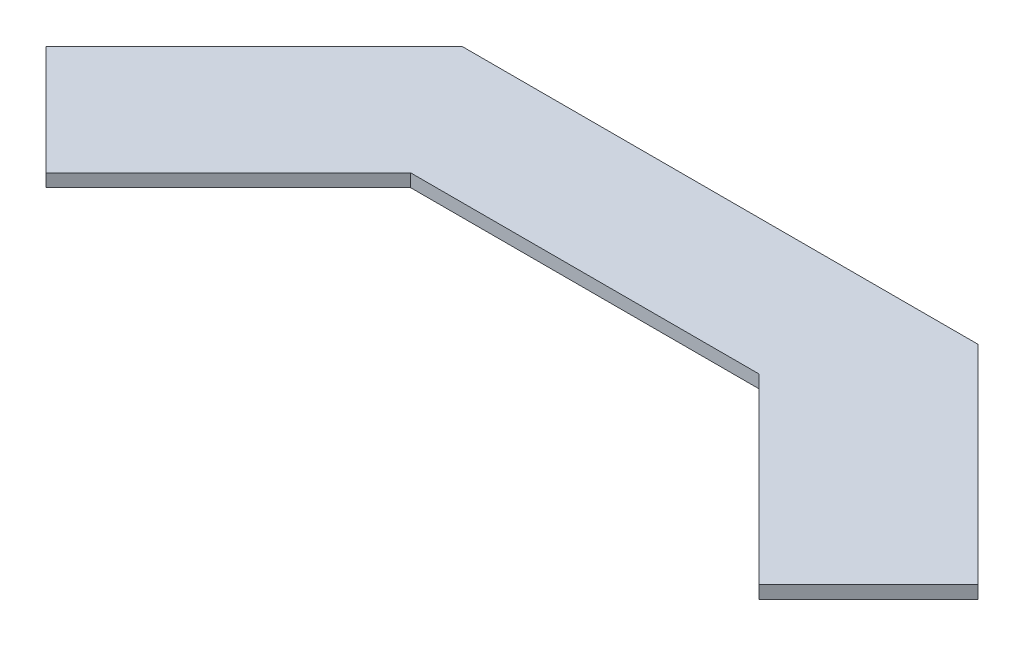
ISO-10303-21;
HEADER;
FILE_DESCRIPTION(('STEP AP214'),'2;1');
FILE_NAME('part.step','',(''),(''),'','','');
FILE_SCHEMA(('AUTOMOTIVE_DESIGN { 1 0 10303 214 1 1 1 1 }'));
ENDSEC;
DATA;
#1=APPLICATION_CONTEXT('core data for automotive mechanical design processes');
#2=APPLICATION_PROTOCOL_DEFINITION('international standard','automotive_design',2000,#1);
#3=PRODUCT_CONTEXT('',#1,'mechanical');
#4=PRODUCT('Part','Part','',(#3));
#5=PRODUCT_RELATED_PRODUCT_CATEGORY('part','',(#4));
#6=PRODUCT_DEFINITION_FORMATION('','',#4);
#7=PRODUCT_DEFINITION_CONTEXT('part definition',#1,'design');
#8=PRODUCT_DEFINITION('design','',#6,#7);
#9=PRODUCT_DEFINITION_SHAPE('','',#8);
#10=(LENGTH_UNIT() NAMED_UNIT(*) SI_UNIT(.MILLI.,.METRE.));
#11=(NAMED_UNIT(*) PLANE_ANGLE_UNIT() SI_UNIT($,.RADIAN.));
#12=(NAMED_UNIT(*) SI_UNIT($,.STERADIAN.) SOLID_ANGLE_UNIT());
#13=UNCERTAINTY_MEASURE_WITH_UNIT(LENGTH_MEASURE(1.E-05),#10,'distance_accuracy_value','');
#14=(GEOMETRIC_REPRESENTATION_CONTEXT(3) GLOBAL_UNCERTAINTY_ASSIGNED_CONTEXT((#13)) GLOBAL_UNIT_ASSIGNED_CONTEXT((#10,
#11,#12)) REPRESENTATION_CONTEXT('',''));
#15=CARTESIAN_POINT('',(0.,0.,0.));
#16=DIRECTION('',(0.,0.,1.));
#17=DIRECTION('',(1.,0.,0.));
#18=AXIS2_PLACEMENT_3D('',#15,#16,#17);
#19=CARTESIAN_POINT('',(-85.8184632735846,6.35,0.));
#20=DIRECTION('',(0.,0.,-1.));
#21=DIRECTION('',(-1.,0.,0.));
#22=AXIS2_PLACEMENT_3D('',#19,#20,#21);
#23=PLANE('',#22);
#24=DIRECTION('',(1.,0.,0.));
#25=VECTOR('',#24,1.);
#26=CARTESIAN_POINT('',(-85.8184632735846,0.,0.));
#27=LINE('',#26,#25);
#28=CARTESIAN_POINT('',(-85.8184632735846,0.,0.));
#29=VERTEX_POINT('',#28);
#30=CARTESIAN_POINT('',(85.818463273585,0.,1.05351117430378E-13));
#31=VERTEX_POINT('',#30);
#32=EDGE_CURVE('E155',#29,#31,#27,.T.);
#33=ORIENTED_EDGE('',*,*,#32,.T.);
#34=DIRECTION('',(0.,-1.,0.));
#35=VECTOR('',#34,1.);
#36=CARTESIAN_POINT('',(85.818463273585,6.35,1.05351117430378E-13));
#37=LINE('',#36,#35);
#38=CARTESIAN_POINT('',(85.818463273585,6.35,1.05351117430378E-13));
#39=VERTEX_POINT('',#38);
#40=EDGE_CURVE('E11',#39,#31,#37,.T.);
#41=ORIENTED_EDGE('',*,*,#40,.F.);
#42=DIRECTION('',(1.,0.,0.));
#43=VECTOR('',#42,1.);
#44=CARTESIAN_POINT('',(-85.8184632735846,6.35,0.));
#45=LINE('',#44,#43);
#46=CARTESIAN_POINT('',(-85.8184632735846,6.35,0.));
#47=VERTEX_POINT('',#46);
#48=EDGE_CURVE('E178',#47,#39,#45,.T.);
#49=ORIENTED_EDGE('',*,*,#48,.F.);
#50=DIRECTION('',(0.,-1.,0.));
#51=VECTOR('',#50,1.);
#52=CARTESIAN_POINT('',(-85.8184632735846,6.35,0.));
#53=LINE('',#52,#51);
#54=EDGE_CURVE('E151',#47,#29,#53,.T.);
#55=ORIENTED_EDGE('',*,*,#54,.T.);
#56=EDGE_LOOP('',(#33,#41,#49,#55));
#57=FACE_BOUND('',#56,.T.);
#58=ADVANCED_FACE('F38',(#57),#23,.F.);
#59=CARTESIAN_POINT('',(175.621024484277,6.35,89.8025612106914));
#60=DIRECTION('',(0.707106781186544,0.,-0.707106781186551));
#61=DIRECTION('',(-0.707106781186551,0.,-0.707106781186544));
#62=AXIS2_PLACEMENT_3D('',#59,#60,#61);
#63=PLANE('',#62);
#64=DIRECTION('',(0.707106781186551,0.,0.707106781186544));
#65=VECTOR('',#64,1.);
#66=CARTESIAN_POINT('',(175.621024484277,0.,89.8025612106914));
#67=LINE('',#66,#65);
#68=CARTESIAN_POINT('',(175.621024484277,0.,89.8025612106914));
#69=VERTEX_POINT('',#68);
#70=EDGE_CURVE('E159',#31,#69,#67,.T.);
#71=ORIENTED_EDGE('',*,*,#70,.T.);
#72=DIRECTION('',(0.,-1.,0.));
#73=VECTOR('',#72,1.);
#74=CARTESIAN_POINT('',(175.621024484277,6.35,89.8025612106914));
#75=LINE('',#74,#73);
#76=CARTESIAN_POINT('',(175.621024484277,6.35,89.8025612106914));
#77=VERTEX_POINT('',#76);
#78=EDGE_CURVE('E47',#77,#69,#75,.T.);
#79=ORIENTED_EDGE('',*,*,#78,.F.);
#80=DIRECTION('',(0.707106781186551,0.,0.707106781186544));
#81=VECTOR('',#80,1.);
#82=CARTESIAN_POINT('',(175.621024484277,6.35,89.8025612106914));
#83=LINE('',#82,#81);
#84=EDGE_CURVE('E109',#39,#77,#83,.T.);
#85=ORIENTED_EDGE('',*,*,#84,.F.);
#86=ORIENTED_EDGE('',*,*,#40,.T.);
#87=EDGE_LOOP('',(#71,#79,#85,#86));
#88=FACE_BOUND('',#87,.T.);
#89=ADVANCED_FACE('F223',(#88),#63,.F.);
#90=CARTESIAN_POINT('',(229.502561210692,6.35,35.9210244842762));
#91=DIRECTION('',(-0.707106781186551,0.,-0.707106781186543));
#92=DIRECTION('',(-0.707106781186544,0.,0.707106781186552));
#93=AXIS2_PLACEMENT_3D('',#90,#91,#92);
#94=PLANE('',#93);
#95=DIRECTION('',(0.707106781186543,0.,-0.707106781186552));
#96=VECTOR('',#95,1.);
#97=CARTESIAN_POINT('',(229.502561210692,0.,35.9210244842762));
#98=LINE('',#97,#96);
#99=CARTESIAN_POINT('',(229.502561210692,0.,35.9210244842762));
#100=VERTEX_POINT('',#99);
#101=EDGE_CURVE('E162',#69,#100,#98,.T.);
#102=ORIENTED_EDGE('',*,*,#101,.T.);
#103=DIRECTION('',(0.,-1.,0.));
#104=VECTOR('',#103,1.);
#105=CARTESIAN_POINT('',(229.502561210692,6.35,35.9210244842762));
#106=LINE('',#105,#104);
#107=CARTESIAN_POINT('',(229.502561210692,6.35,35.9210244842762));
#108=VERTEX_POINT('',#107);
#109=EDGE_CURVE('E189',#108,#100,#106,.T.);
#110=ORIENTED_EDGE('',*,*,#109,.F.);
#111=DIRECTION('',(0.707106781186543,0.,-0.707106781186552));
#112=VECTOR('',#111,1.);
#113=CARTESIAN_POINT('',(229.502561210692,6.35,35.9210244842762));
#114=LINE('',#113,#112);
#115=EDGE_CURVE('E199',#77,#108,#114,.T.);
#116=ORIENTED_EDGE('',*,*,#115,.F.);
#117=ORIENTED_EDGE('',*,*,#78,.T.);
#118=EDGE_LOOP('',(#102,#110,#116,#117));
#119=FACE_BOUND('',#118,.T.);
#120=ADVANCED_FACE('F197',(#119),#94,.F.);
#121=CARTESIAN_POINT('',(127.,6.35,-66.5815367264155));
#122=DIRECTION('',(-0.707106781186552,0.,0.707106781186543));
#123=DIRECTION('',(0.707106781186543,0.,0.707106781186552));
#124=AXIS2_PLACEMENT_3D('',#121,#122,#123);
#125=PLANE('',#124);
#126=DIRECTION('',(-0.707106781186543,0.,-0.707106781186552));
#127=VECTOR('',#126,1.);
#128=CARTESIAN_POINT('',(127.,0.,-66.5815367264155));
#129=LINE('',#128,#127);
#130=CARTESIAN_POINT('',(127.,0.,-66.5815367264155));
#131=VERTEX_POINT('',#130);
#132=EDGE_CURVE('E166',#100,#131,#129,.T.);
#133=ORIENTED_EDGE('',*,*,#132,.T.);
#134=DIRECTION('',(0.,-1.,0.));
#135=VECTOR('',#134,1.);
#136=CARTESIAN_POINT('',(127.,6.35,-66.5815367264155));
#137=LINE('',#136,#135);
#138=CARTESIAN_POINT('',(127.,6.35,-66.5815367264155));
#139=VERTEX_POINT('',#138);
#140=EDGE_CURVE('E185',#139,#131,#137,.T.);
#141=ORIENTED_EDGE('',*,*,#140,.F.);
#142=DIRECTION('',(-0.707106781186551,0.,-0.707106781186544));
#143=VECTOR('',#142,1.);
#144=CARTESIAN_POINT('',(229.502561210692,6.35,35.9210244842762));
#145=LINE('',#144,#143);
#146=EDGE_CURVE('E211',#108,#139,#145,.T.);
#147=ORIENTED_EDGE('',*,*,#146,.F.);
#148=ORIENTED_EDGE('',*,*,#109,.T.);
#149=EDGE_LOOP('',(#133,#141,#147,#148));
#150=FACE_BOUND('',#149,.T.);
#151=ADVANCED_FACE('F206',(#150),#125,.F.);
#152=CARTESIAN_POINT('',(127.,6.35,-66.5815367264155));
#153=DIRECTION('',(0.,0.,1.));
#154=DIRECTION('',(1.,0.,0.));
#155=AXIS2_PLACEMENT_3D('',#152,#153,#154);
#156=PLANE('',#155);
#157=DIRECTION('',(-1.,0.,0.));
#158=VECTOR('',#157,1.);
#159=CARTESIAN_POINT('',(127.,0.,-66.5815367264155));
#160=LINE('',#159,#158);
#161=CARTESIAN_POINT('',(-127.,0.,-66.5815367264155));
#162=VERTEX_POINT('',#161);
#163=EDGE_CURVE('E168',#131,#162,#160,.T.);
#164=ORIENTED_EDGE('',*,*,#163,.T.);
#165=DIRECTION('',(0.,-1.,0.));
#166=VECTOR('',#165,1.);
#167=CARTESIAN_POINT('',(-127.,6.35,-66.5815367264155));
#168=LINE('',#167,#166);
#169=CARTESIAN_POINT('',(-127.,6.35,-66.5815367264155));
#170=VERTEX_POINT('',#169);
#171=EDGE_CURVE('E143',#170,#162,#168,.T.);
#172=ORIENTED_EDGE('',*,*,#171,.F.);
#173=DIRECTION('',(-1.,0.,0.));
#174=VECTOR('',#173,1.);
#175=CARTESIAN_POINT('',(127.,6.35,-66.5815367264155));
#176=LINE('',#175,#174);
#177=EDGE_CURVE('E133',#139,#170,#176,.T.);
#178=ORIENTED_EDGE('',*,*,#177,.F.);
#179=ORIENTED_EDGE('',*,*,#140,.T.);
#180=EDGE_LOOP('',(#164,#172,#178,#179));
#181=FACE_BOUND('',#180,.T.);
#182=ADVANCED_FACE('F209',(#181),#156,.F.);
#183=CARTESIAN_POINT('',(-229.502561210692,6.35,35.9210244842762));
#184=DIRECTION('',(0.707106781186543,0.,0.707106781186552));
#185=DIRECTION('',(0.707106781186552,0.,-0.707106781186543));
#186=AXIS2_PLACEMENT_3D('',#183,#184,#185);
#187=PLANE('',#186);
#188=DIRECTION('',(-0.707106781186552,0.,0.707106781186543));
#189=VECTOR('',#188,1.);
#190=CARTESIAN_POINT('',(-229.502561210692,0.,35.9210244842762));
#191=LINE('',#190,#189);
#192=CARTESIAN_POINT('',(-229.502561210692,0.,35.9210244842762));
#193=VERTEX_POINT('',#192);
#194=EDGE_CURVE('E141',#162,#193,#191,.T.);
#195=ORIENTED_EDGE('',*,*,#194,.T.);
#196=DIRECTION('',(0.,-1.,0.));
#197=VECTOR('',#196,1.);
#198=CARTESIAN_POINT('',(-229.502561210692,6.35,35.9210244842762));
#199=LINE('',#198,#197);
#200=CARTESIAN_POINT('',(-229.502561210692,6.35,35.9210244842762));
#201=VERTEX_POINT('',#200);
#202=EDGE_CURVE('E139',#201,#193,#199,.T.);
#203=ORIENTED_EDGE('',*,*,#202,.F.);
#204=DIRECTION('',(-0.707106781186542,0.,0.707106781186554));
#205=VECTOR('',#204,1.);
#206=CARTESIAN_POINT('',(-127.,6.35,-66.5815367264155));
#207=LINE('',#206,#205);
#208=EDGE_CURVE('E127',#170,#201,#207,.T.);
#209=ORIENTED_EDGE('',*,*,#208,.F.);
#210=ORIENTED_EDGE('',*,*,#171,.T.);
#211=EDGE_LOOP('',(#195,#203,#209,#210));
#212=FACE_BOUND('',#211,.T.);
#213=ADVANCED_FACE('F140',(#212),#187,.F.);
#214=CARTESIAN_POINT('',(-229.502561210692,6.35,35.9210244842762));
#215=DIRECTION('',(0.707106781186551,0.,-0.707106781186544));
#216=DIRECTION('',(-0.707106781186544,0.,-0.707106781186551));
#217=AXIS2_PLACEMENT_3D('',#214,#215,#216);
#218=PLANE('',#217);
#219=DIRECTION('',(0.707106781186544,0.,0.707106781186551));
#220=VECTOR('',#219,1.);
#221=CARTESIAN_POINT('',(-229.502561210692,0.,35.9210244842762));
#222=LINE('',#221,#220);
#223=CARTESIAN_POINT('',(-175.621024484277,0.,89.8025612106914));
#224=VERTEX_POINT('',#223);
#225=EDGE_CURVE('E94',#193,#224,#222,.T.);
#226=ORIENTED_EDGE('',*,*,#225,.T.);
#227=DIRECTION('',(0.,-1.,0.));
#228=VECTOR('',#227,1.);
#229=CARTESIAN_POINT('',(-175.621024484277,6.35,89.8025612106914));
#230=LINE('',#229,#228);
#231=CARTESIAN_POINT('',(-175.621024484277,6.35,89.8025612106914));
#232=VERTEX_POINT('',#231);
#233=EDGE_CURVE('E144',#232,#224,#230,.T.);
#234=ORIENTED_EDGE('',*,*,#233,.F.);
#235=DIRECTION('',(0.707106781186544,0.,0.707106781186551));
#236=VECTOR('',#235,1.);
#237=CARTESIAN_POINT('',(-229.502561210692,6.35,35.9210244842762));
#238=LINE('',#237,#236);
#239=EDGE_CURVE('E131',#201,#232,#238,.T.);
#240=ORIENTED_EDGE('',*,*,#239,.F.);
#241=ORIENTED_EDGE('',*,*,#202,.T.);
#242=EDGE_LOOP('',(#226,#234,#240,#241));
#243=FACE_BOUND('',#242,.T.);
#244=ADVANCED_FACE('F146',(#243),#218,.F.);
#245=CARTESIAN_POINT('',(-175.621024484277,6.35,89.8025612106914));
#246=DIRECTION('',(-0.707106781186543,0.,-0.707106781186552));
#247=DIRECTION('',(-0.707106781186552,0.,0.707106781186543));
#248=AXIS2_PLACEMENT_3D('',#245,#246,#247);
#249=PLANE('',#248);
#250=DIRECTION('',(0.707106781186552,0.,-0.707106781186543));
#251=VECTOR('',#250,1.);
#252=CARTESIAN_POINT('',(-175.621024484277,0.,89.8025612106914));
#253=LINE('',#252,#251);
#254=EDGE_CURVE('E101',#224,#29,#253,.T.);
#255=ORIENTED_EDGE('',*,*,#254,.T.);
#256=ORIENTED_EDGE('',*,*,#54,.F.);
#257=DIRECTION('',(0.707106781186552,0.,-0.707106781186543));
#258=VECTOR('',#257,1.);
#259=CARTESIAN_POINT('',(-175.621024484277,6.35,89.8025612106914));
#260=LINE('',#259,#258);
#261=EDGE_CURVE('E58',#232,#47,#260,.T.);
#262=ORIENTED_EDGE('',*,*,#261,.F.);
#263=ORIENTED_EDGE('',*,*,#233,.T.);
#264=EDGE_LOOP('',(#255,#256,#262,#263));
#265=FACE_BOUND('',#264,.T.);
#266=ADVANCED_FACE('F238',(#265),#249,.F.);
#267=CARTESIAN_POINT('',(0.,6.35,0.));
#268=DIRECTION('',(0.,1.,0.));
#269=DIRECTION('',(0.,0.,1.));
#270=AXIS2_PLACEMENT_3D('',#267,#268,#269);
#271=PLANE('',#270);
#272=ORIENTED_EDGE('',*,*,#48,.T.);
#273=ORIENTED_EDGE('',*,*,#84,.T.);
#274=ORIENTED_EDGE('',*,*,#115,.T.);
#275=ORIENTED_EDGE('',*,*,#146,.T.);
#276=ORIENTED_EDGE('',*,*,#177,.T.);
#277=ORIENTED_EDGE('',*,*,#208,.T.);
#278=ORIENTED_EDGE('',*,*,#239,.T.);
#279=ORIENTED_EDGE('',*,*,#261,.T.);
#280=EDGE_LOOP('',(#272,#273,#274,#275,#276,#277,#278,#279));
#281=FACE_BOUND('',#280,.T.);
#282=ADVANCED_FACE('F129',(#281),#271,.T.);
#283=CARTESIAN_POINT('',(0.,0.,0.));
#284=DIRECTION('',(0.,1.,0.));
#285=DIRECTION('',(0.,0.,1.));
#286=AXIS2_PLACEMENT_3D('',#283,#284,#285);
#287=PLANE('',#286);
#288=ORIENTED_EDGE('',*,*,#32,.F.);
#289=ORIENTED_EDGE('',*,*,#254,.F.);
#290=ORIENTED_EDGE('',*,*,#225,.F.);
#291=ORIENTED_EDGE('',*,*,#194,.F.);
#292=ORIENTED_EDGE('',*,*,#163,.F.);
#293=ORIENTED_EDGE('',*,*,#132,.F.);
#294=ORIENTED_EDGE('',*,*,#101,.F.);
#295=ORIENTED_EDGE('',*,*,#70,.F.);
#296=EDGE_LOOP('',(#288,#289,#290,#291,#292,#293,#294,#295));
#297=FACE_BOUND('',#296,.T.);
#298=ADVANCED_FACE('F202',(#297),#287,.F.);
#299=CLOSED_SHELL('',(#58,#89,#120,#151,#182,#213,#244,#266,#282,#298));
#300=MANIFOLD_SOLID_BREP('B2',#299);
#301=ADVANCED_BREP_SHAPE_REPRESENTATION('',(#18,#300),#14);
#302=SHAPE_DEFINITION_REPRESENTATION(#9,#301);
ENDSEC;
END-ISO-10303-21;
